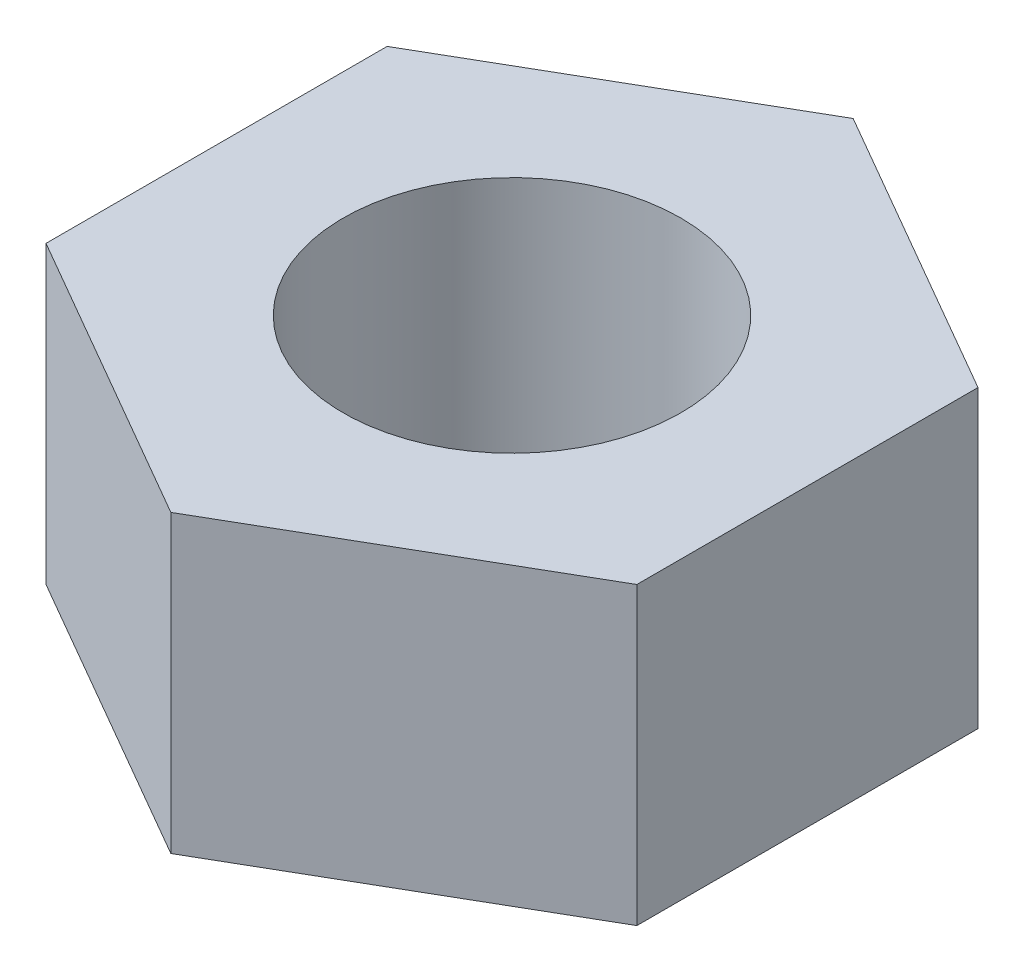
ISO-10303-21;
HEADER;
FILE_DESCRIPTION(('STEP AP214'),'2;1');
FILE_NAME('part.step','',(''),(''),'','','');
FILE_SCHEMA(('AUTOMOTIVE_DESIGN { 1 0 10303 214 1 1 1 1 }'));
ENDSEC;
DATA;
#1=APPLICATION_CONTEXT('core data for automotive mechanical design processes');
#2=APPLICATION_PROTOCOL_DEFINITION('international standard','automotive_design',2000,#1);
#3=PRODUCT_CONTEXT('',#1,'mechanical');
#4=PRODUCT('Part','Part','',(#3));
#5=PRODUCT_RELATED_PRODUCT_CATEGORY('part','',(#4));
#6=PRODUCT_DEFINITION_FORMATION('','',#4);
#7=PRODUCT_DEFINITION_CONTEXT('part definition',#1,'design');
#8=PRODUCT_DEFINITION('design','',#6,#7);
#9=PRODUCT_DEFINITION_SHAPE('','',#8);
#10=(LENGTH_UNIT() NAMED_UNIT(*) SI_UNIT(.MILLI.,.METRE.));
#11=(NAMED_UNIT(*) PLANE_ANGLE_UNIT() SI_UNIT($,.RADIAN.));
#12=(NAMED_UNIT(*) SI_UNIT($,.STERADIAN.) SOLID_ANGLE_UNIT());
#13=UNCERTAINTY_MEASURE_WITH_UNIT(LENGTH_MEASURE(1.E-05),#10,'distance_accuracy_value','');
#14=(GEOMETRIC_REPRESENTATION_CONTEXT(3) GLOBAL_UNCERTAINTY_ASSIGNED_CONTEXT((#13)) GLOBAL_UNIT_ASSIGNED_CONTEXT((#10,
#11,#12)) REPRESENTATION_CONTEXT('',''));
#15=CARTESIAN_POINT('',(0.,0.,0.));
#16=DIRECTION('',(0.,0.,1.));
#17=DIRECTION('',(1.,0.,0.));
#18=AXIS2_PLACEMENT_3D('',#15,#16,#17);
#19=CARTESIAN_POINT('',(0.,2.778125,0.));
#20=DIRECTION('',(0.,1.,0.));
#21=DIRECTION('',(0.,0.,1.));
#22=AXIS2_PLACEMENT_3D('',#19,#20,#21);
#23=PLANE('',#22);
#24=DIRECTION('',(-0.866025403784439,0.,-0.5));
#25=VECTOR('',#24,1.);
#26=CARTESIAN_POINT('',(5.55625,2.778125,-3.20790243318486));
#27=LINE('',#26,#25);
#28=CARTESIAN_POINT('',(5.55625,2.778125,-3.20790243318486));
#29=VERTEX_POINT('',#28);
#30=CARTESIAN_POINT('',(0.,2.778125,-6.41580486636971));
#31=VERTEX_POINT('',#30);
#32=EDGE_CURVE('E130',#29,#31,#27,.T.);
#33=ORIENTED_EDGE('',*,*,#32,.T.);
#34=DIRECTION('',(-0.866025403784439,0.,0.5));
#35=VECTOR('',#34,1.);
#36=CARTESIAN_POINT('',(0.,2.778125,-6.41580486636971));
#37=LINE('',#36,#35);
#38=CARTESIAN_POINT('',(-5.55625,2.778125,-3.20790243318486));
#39=VERTEX_POINT('',#38);
#40=EDGE_CURVE('E97',#31,#39,#37,.T.);
#41=ORIENTED_EDGE('',*,*,#40,.T.);
#42=DIRECTION('',(0.,0.,1.));
#43=VECTOR('',#42,1.);
#44=CARTESIAN_POINT('',(-5.55625,2.778125,-3.20790243318486));
#45=LINE('',#44,#43);
#46=CARTESIAN_POINT('',(-5.55625,2.778125,3.20790243318486));
#47=VERTEX_POINT('',#46);
#48=EDGE_CURVE('E133',#39,#47,#45,.T.);
#49=ORIENTED_EDGE('',*,*,#48,.T.);
#50=DIRECTION('',(0.866025403784439,0.,0.5));
#51=VECTOR('',#50,1.);
#52=CARTESIAN_POINT('',(-5.55625,2.778125,3.20790243318486));
#53=LINE('',#52,#51);
#54=CARTESIAN_POINT('',(0.,2.778125,6.41580486636971));
#55=VERTEX_POINT('',#54);
#56=EDGE_CURVE('E135',#47,#55,#53,.T.);
#57=ORIENTED_EDGE('',*,*,#56,.T.);
#58=DIRECTION('',(0.866025403784439,0.,-0.5));
#59=VECTOR('',#58,1.);
#60=CARTESIAN_POINT('',(0.,2.778125,6.41580486636971));
#61=LINE('',#60,#59);
#62=CARTESIAN_POINT('',(5.55625,2.778125,3.20790243318486));
#63=VERTEX_POINT('',#62);
#64=EDGE_CURVE('E61',#55,#63,#61,.T.);
#65=ORIENTED_EDGE('',*,*,#64,.T.);
#66=DIRECTION('',(0.,0.,-1.));
#67=VECTOR('',#66,1.);
#68=CARTESIAN_POINT('',(5.55625,2.778125,3.20790243318486));
#69=LINE('',#68,#67);
#70=EDGE_CURVE('E56',#63,#29,#69,.T.);
#71=ORIENTED_EDGE('',*,*,#70,.T.);
#72=EDGE_LOOP('',(#33,#41,#49,#57,#65,#71));
#73=FACE_BOUND('',#72,.T.);
#74=CARTESIAN_POINT('',(0.,2.778125,0.));
#75=DIRECTION('',(0.,1.,0.));
#76=DIRECTION('',(0.,0.,1.));
#77=AXIS2_PLACEMENT_3D('',#74,#75,#76);
#78=CIRCLE('',#77,3.175);
#79=CARTESIAN_POINT('',(0.,2.778125,-3.175));
#80=VERTEX_POINT('',#79);
#81=EDGE_CURVE('E127',#80,#80,#78,.T.);
#82=ORIENTED_EDGE('',*,*,#81,.F.);
#83=EDGE_LOOP('',(#82));
#84=FACE_BOUND('',#83,.T.);
#85=ADVANCED_FACE('F41',(#73,#84),#23,.T.);
#86=CARTESIAN_POINT('',(5.55625,2.778125,-3.20790243318486));
#87=DIRECTION('',(-0.5,0.,0.866025403784439));
#88=DIRECTION('',(0.866025403784439,0.,0.5));
#89=AXIS2_PLACEMENT_3D('',#86,#87,#88);
#90=PLANE('',#89);
#91=DIRECTION('',(0.,-1.,0.));
#92=VECTOR('',#91,1.);
#93=CARTESIAN_POINT('',(5.55625,2.778125,-3.20790243318486));
#94=LINE('',#93,#92);
#95=CARTESIAN_POINT('',(5.55625,-2.778125,-3.20790243318486));
#96=VERTEX_POINT('',#95);
#97=EDGE_CURVE('E112',#29,#96,#94,.T.);
#98=ORIENTED_EDGE('',*,*,#97,.T.);
#99=DIRECTION('',(-0.866025403784439,0.,-0.5));
#100=VECTOR('',#99,1.);
#101=CARTESIAN_POINT('',(5.55625,-2.778125,-3.20790243318486));
#102=LINE('',#101,#100);
#103=CARTESIAN_POINT('',(0.,-2.778125,-6.41580486636971));
#104=VERTEX_POINT('',#103);
#105=EDGE_CURVE('E106',#96,#104,#102,.T.);
#106=ORIENTED_EDGE('',*,*,#105,.T.);
#107=DIRECTION('',(0.,-1.,0.));
#108=VECTOR('',#107,1.);
#109=CARTESIAN_POINT('',(0.,2.778125,-6.41580486636971));
#110=LINE('',#109,#108);
#111=EDGE_CURVE('E11',#31,#104,#110,.T.);
#112=ORIENTED_EDGE('',*,*,#111,.F.);
#113=ORIENTED_EDGE('',*,*,#32,.F.);
#114=EDGE_LOOP('',(#98,#106,#112,#113));
#115=FACE_BOUND('',#114,.T.);
#116=ADVANCED_FACE('F43',(#115),#90,.F.);
#117=CARTESIAN_POINT('',(0.,2.778125,-6.41580486636971));
#118=DIRECTION('',(0.499999999999999,0.,0.866025403784439));
#119=DIRECTION('',(0.866025403784439,0.,-0.5));
#120=AXIS2_PLACEMENT_3D('',#117,#118,#119);
#121=PLANE('',#120);
#122=ORIENTED_EDGE('',*,*,#111,.T.);
#123=DIRECTION('',(-0.866025403784439,0.,0.5));
#124=VECTOR('',#123,1.);
#125=CARTESIAN_POINT('',(0.,-2.778125,-6.41580486636971));
#126=LINE('',#125,#124);
#127=CARTESIAN_POINT('',(-5.55625,-2.778125,-3.20790243318486));
#128=VERTEX_POINT('',#127);
#129=EDGE_CURVE('E96',#104,#128,#126,.T.);
#130=ORIENTED_EDGE('',*,*,#129,.T.);
#131=DIRECTION('',(0.,-1.,0.));
#132=VECTOR('',#131,1.);
#133=CARTESIAN_POINT('',(-5.55625,2.778125,-3.20790243318486));
#134=LINE('',#133,#132);
#135=EDGE_CURVE('E49',#39,#128,#134,.T.);
#136=ORIENTED_EDGE('',*,*,#135,.F.);
#137=ORIENTED_EDGE('',*,*,#40,.F.);
#138=EDGE_LOOP('',(#122,#130,#136,#137));
#139=FACE_BOUND('',#138,.T.);
#140=ADVANCED_FACE('F94',(#139),#121,.F.);
#141=CARTESIAN_POINT('',(-5.55625,2.778125,-3.20790243318486));
#142=DIRECTION('',(1.,0.,0.));
#143=DIRECTION('',(0.,0.,-1.));
#144=AXIS2_PLACEMENT_3D('',#141,#142,#143);
#145=PLANE('',#144);
#146=ORIENTED_EDGE('',*,*,#135,.T.);
#147=DIRECTION('',(0.,0.,1.));
#148=VECTOR('',#147,1.);
#149=CARTESIAN_POINT('',(-5.55625,-2.778125,-3.20790243318486));
#150=LINE('',#149,#148);
#151=CARTESIAN_POINT('',(-5.55625,-2.778125,3.20790243318486));
#152=VERTEX_POINT('',#151);
#153=EDGE_CURVE('E110',#128,#152,#150,.T.);
#154=ORIENTED_EDGE('',*,*,#153,.T.);
#155=DIRECTION('',(0.,-1.,0.));
#156=VECTOR('',#155,1.);
#157=CARTESIAN_POINT('',(-5.55625,2.778125,3.20790243318486));
#158=LINE('',#157,#156);
#159=EDGE_CURVE('E144',#47,#152,#158,.T.);
#160=ORIENTED_EDGE('',*,*,#159,.F.);
#161=ORIENTED_EDGE('',*,*,#48,.F.);
#162=EDGE_LOOP('',(#146,#154,#160,#161));
#163=FACE_BOUND('',#162,.T.);
#164=ADVANCED_FACE('F147',(#163),#145,.F.);
#165=CARTESIAN_POINT('',(-5.55625,2.778125,3.20790243318486));
#166=DIRECTION('',(0.499999999999999,0.,-0.866025403784439));
#167=DIRECTION('',(-0.866025403784439,0.,-0.5));
#168=AXIS2_PLACEMENT_3D('',#165,#166,#167);
#169=PLANE('',#168);
#170=ORIENTED_EDGE('',*,*,#159,.T.);
#171=DIRECTION('',(0.866025403784439,0.,0.5));
#172=VECTOR('',#171,1.);
#173=CARTESIAN_POINT('',(-5.55625,-2.778125,3.20790243318486));
#174=LINE('',#173,#172);
#175=CARTESIAN_POINT('',(0.,-2.778125,6.41580486636971));
#176=VERTEX_POINT('',#175);
#177=EDGE_CURVE('E119',#152,#176,#174,.T.);
#178=ORIENTED_EDGE('',*,*,#177,.T.);
#179=DIRECTION('',(0.,-1.,0.));
#180=VECTOR('',#179,1.);
#181=CARTESIAN_POINT('',(0.,2.778125,6.41580486636971));
#182=LINE('',#181,#180);
#183=EDGE_CURVE('E142',#55,#176,#182,.T.);
#184=ORIENTED_EDGE('',*,*,#183,.F.);
#185=ORIENTED_EDGE('',*,*,#56,.F.);
#186=EDGE_LOOP('',(#170,#178,#184,#185));
#187=FACE_BOUND('',#186,.T.);
#188=ADVANCED_FACE('F153',(#187),#169,.F.);
#189=CARTESIAN_POINT('',(0.,2.778125,6.41580486636971));
#190=DIRECTION('',(-0.5,0.,-0.866025403784439));
#191=DIRECTION('',(-0.866025403784439,0.,0.5));
#192=AXIS2_PLACEMENT_3D('',#189,#190,#191);
#193=PLANE('',#192);
#194=ORIENTED_EDGE('',*,*,#183,.T.);
#195=DIRECTION('',(0.866025403784439,0.,-0.5));
#196=VECTOR('',#195,1.);
#197=CARTESIAN_POINT('',(0.,-2.778125,6.41580486636971));
#198=LINE('',#197,#196);
#199=CARTESIAN_POINT('',(5.55625,-2.778125,3.20790243318486));
#200=VERTEX_POINT('',#199);
#201=EDGE_CURVE('E122',#176,#200,#198,.T.);
#202=ORIENTED_EDGE('',*,*,#201,.T.);
#203=DIRECTION('',(0.,-1.,0.));
#204=VECTOR('',#203,1.);
#205=CARTESIAN_POINT('',(5.55625,2.778125,3.20790243318486));
#206=LINE('',#205,#204);
#207=EDGE_CURVE('E140',#63,#200,#206,.T.);
#208=ORIENTED_EDGE('',*,*,#207,.F.);
#209=ORIENTED_EDGE('',*,*,#64,.F.);
#210=EDGE_LOOP('',(#194,#202,#208,#209));
#211=FACE_BOUND('',#210,.T.);
#212=ADVANCED_FACE('F156',(#211),#193,.F.);
#213=CARTESIAN_POINT('',(5.55625,2.778125,3.20790243318486));
#214=DIRECTION('',(-1.,0.,0.));
#215=DIRECTION('',(0.,0.,1.));
#216=AXIS2_PLACEMENT_3D('',#213,#214,#215);
#217=PLANE('',#216);
#218=ORIENTED_EDGE('',*,*,#207,.T.);
#219=DIRECTION('',(0.,0.,-1.));
#220=VECTOR('',#219,1.);
#221=CARTESIAN_POINT('',(5.55625,-2.778125,3.20790243318486));
#222=LINE('',#221,#220);
#223=EDGE_CURVE('E125',#200,#96,#222,.T.);
#224=ORIENTED_EDGE('',*,*,#223,.T.);
#225=ORIENTED_EDGE('',*,*,#97,.F.);
#226=ORIENTED_EDGE('',*,*,#70,.F.);
#227=EDGE_LOOP('',(#218,#224,#225,#226));
#228=FACE_BOUND('',#227,.T.);
#229=ADVANCED_FACE('F158',(#228),#217,.F.);
#230=CARTESIAN_POINT('',(0.,2.778125,0.));
#231=DIRECTION('',(0.,-1.,0.));
#232=DIRECTION('',(0.,0.,-1.));
#233=AXIS2_PLACEMENT_3D('',#230,#231,#232);
#234=CYLINDRICAL_SURFACE('',#233,3.175);
#235=CARTESIAN_POINT('',(0.,-2.778125,0.));
#236=DIRECTION('',(0.,1.,0.));
#237=DIRECTION('',(0.,0.,1.));
#238=AXIS2_PLACEMENT_3D('',#235,#236,#237);
#239=CIRCLE('',#238,3.175);
#240=CARTESIAN_POINT('',(0.,-2.778125,-3.175));
#241=VERTEX_POINT('',#240);
#242=EDGE_CURVE('E113',#241,#241,#239,.T.);
#243=CARTESIAN_POINT('',(0.,2.778125,-3.175));
#244=CARTESIAN_POINT('',(0.,2.72024739583334,-3.175));
#245=CARTESIAN_POINT('',(0.,2.66236979166667,-3.175));
#246=CARTESIAN_POINT('',(0.,2.54661458333334,-3.175));
#247=CARTESIAN_POINT('',(0.,2.48873697916667,-3.175));
#248=CARTESIAN_POINT('',(0.,2.37298177083334,-3.175));
#249=CARTESIAN_POINT('',(0.,2.31510416666667,-3.175));
#250=CARTESIAN_POINT('',(0.,2.19934895833334,-3.175));
#251=CARTESIAN_POINT('',(0.,2.14147135416667,-3.175));
#252=CARTESIAN_POINT('',(0.,2.02571614583334,-3.175));
#253=CARTESIAN_POINT('',(0.,1.96783854166667,-3.175));
#254=CARTESIAN_POINT('',(0.,1.85208333333334,-3.175));
#255=CARTESIAN_POINT('',(0.,1.79420572916667,-3.175));
#256=CARTESIAN_POINT('',(0.,1.67845052083334,-3.175));
#257=CARTESIAN_POINT('',(0.,1.62057291666667,-3.175));
#258=CARTESIAN_POINT('',(0.,1.50481770833334,-3.175));
#259=CARTESIAN_POINT('',(0.,1.44694010416667,-3.175));
#260=CARTESIAN_POINT('',(0.,1.33118489583333,-3.175));
#261=CARTESIAN_POINT('',(0.,1.27330729166667,-3.175));
#262=CARTESIAN_POINT('',(0.,1.15755208333333,-3.175));
#263=CARTESIAN_POINT('',(0.,1.09967447916667,-3.175));
#264=CARTESIAN_POINT('',(0.,0.983919270833335,-3.175));
#265=CARTESIAN_POINT('',(0.,0.926041666666668,-3.175));
#266=CARTESIAN_POINT('',(0.,0.810286458333335,-3.175));
#267=CARTESIAN_POINT('',(0.,0.752408854166668,-3.175));
#268=CARTESIAN_POINT('',(0.,0.636653645833335,-3.175));
#269=CARTESIAN_POINT('',(0.,0.578776041666668,-3.175));
#270=CARTESIAN_POINT('',(0.,0.463020833333335,-3.175));
#271=CARTESIAN_POINT('',(0.,0.405143229166668,-3.175));
#272=CARTESIAN_POINT('',(0.,0.289388020833334,-3.175));
#273=CARTESIAN_POINT('',(0.,0.231510416666668,-3.175));
#274=CARTESIAN_POINT('',(0.,0.115755208333334,-3.175));
#275=CARTESIAN_POINT('',(0.,0.0578776041666675,-3.175));
#276=CARTESIAN_POINT('',(0.,-0.0578776041666658,-3.175));
#277=CARTESIAN_POINT('',(0.,-0.115755208333332,-3.175));
#278=CARTESIAN_POINT('',(0.,-0.231510416666666,-3.175));
#279=CARTESIAN_POINT('',(0.,-0.289388020833333,-3.175));
#280=CARTESIAN_POINT('',(0.,-0.405143229166666,-3.175));
#281=CARTESIAN_POINT('',(0.,-0.463020833333333,-3.175));
#282=CARTESIAN_POINT('',(0.,-0.578776041666666,-3.175));
#283=CARTESIAN_POINT('',(0.,-0.636653645833333,-3.175));
#284=CARTESIAN_POINT('',(0.,-0.752408854166666,-3.175));
#285=CARTESIAN_POINT('',(0.,-0.810286458333333,-3.175));
#286=CARTESIAN_POINT('',(0.,-0.926041666666666,-3.175));
#287=CARTESIAN_POINT('',(0.,-0.983919270833333,-3.175));
#288=CARTESIAN_POINT('',(0.,-1.09967447916667,-3.175));
#289=CARTESIAN_POINT('',(0.,-1.15755208333333,-3.175));
#290=CARTESIAN_POINT('',(0.,-1.27330729166667,-3.175));
#291=CARTESIAN_POINT('',(0.,-1.33118489583333,-3.175));
#292=CARTESIAN_POINT('',(0.,-1.44694010416667,-3.175));
#293=CARTESIAN_POINT('',(0.,-1.50481770833333,-3.175));
#294=CARTESIAN_POINT('',(0.,-1.62057291666667,-3.175));
#295=CARTESIAN_POINT('',(0.,-1.67845052083333,-3.175));
#296=CARTESIAN_POINT('',(0.,-1.79420572916667,-3.175));
#297=CARTESIAN_POINT('',(0.,-1.85208333333333,-3.175));
#298=CARTESIAN_POINT('',(0.,-1.96783854166667,-3.175));
#299=CARTESIAN_POINT('',(0.,-2.02571614583333,-3.175));
#300=CARTESIAN_POINT('',(0.,-2.14147135416667,-3.175));
#301=CARTESIAN_POINT('',(0.,-2.19934895833333,-3.175));
#302=CARTESIAN_POINT('',(0.,-2.31510416666667,-3.175));
#303=CARTESIAN_POINT('',(0.,-2.37298177083333,-3.175));
#304=CARTESIAN_POINT('',(0.,-2.48873697916667,-3.175));
#305=CARTESIAN_POINT('',(0.,-2.54661458333333,-3.175));
#306=CARTESIAN_POINT('',(0.,-2.66236979166667,-3.175));
#307=CARTESIAN_POINT('',(0.,-2.72024739583333,-3.175));
#308=CARTESIAN_POINT('',(0.,-2.778125,-3.175));
#309=B_SPLINE_CURVE_WITH_KNOTS('',3,(#243,#244,#245,#246,#247,#248,#249,#250,#251,#252,#253,
#254,#255,#256,#257,#258,#259,#260,#261,#262,#263,#264,#265,#266,#267,#268,#269,#270,#271,#272,
#273,#274,#275,#276,#277,#278,#279,#280,#281,#282,#283,#284,#285,#286,#287,#288,#289,#290,#291,
#292,#293,#294,#295,#296,#297,#298,#299,#300,#301,#302,#303,#304,#305,#306,#307,#308),
.UNSPECIFIED.,.F.,.F.,(4,2,2,2,2,2,2,2,2,2,2,2,2,2,2,2,2,2,2,2,2,2,2,2,2,2,2,2,2,2,2,2,4),(0.,
0.1736328125,0.347265625,0.5208984375,0.69453125,0.8681640625,1.041796875,1.2154296875,
1.3890625,1.5626953125,1.736328125,1.9099609375,2.08359375,2.2572265625,2.430859375,
2.6044921875,2.778125,2.9517578125,3.125390625,3.2990234375,3.47265625,3.6462890625,3.819921875,
3.9935546875,4.1671875,4.3408203125,4.514453125,4.6880859375,4.86171875,5.0353515625,
5.208984375,5.3826171875,5.55625),.UNSPECIFIED.);
#310=EDGE_CURVE('BSEAM160',#80,#241,#309,.T.);
#311=ORIENTED_EDGE('',*,*,#81,.T.);
#312=ORIENTED_EDGE('',*,*,#242,.F.);
#313=ORIENTED_EDGE('',*,*,#310,.T.);
#314=ORIENTED_EDGE('',*,*,#310,.F.);
#315=EDGE_LOOP('',(#311,#313,#312,#314));
#316=FACE_BOUND('',#315,.T.);
#317=ADVANCED_FACE('F160',(#316),#234,.F.);
#318=CARTESIAN_POINT('',(0.,-2.778125,0.));
#319=DIRECTION('',(0.,1.,0.));
#320=DIRECTION('',(0.,0.,1.));
#321=AXIS2_PLACEMENT_3D('',#318,#319,#320);
#322=PLANE('',#321);
#323=ORIENTED_EDGE('',*,*,#242,.T.);
#324=EDGE_LOOP('',(#323));
#325=FACE_BOUND('',#324,.T.);
#326=ORIENTED_EDGE('',*,*,#105,.F.);
#327=ORIENTED_EDGE('',*,*,#223,.F.);
#328=ORIENTED_EDGE('',*,*,#201,.F.);
#329=ORIENTED_EDGE('',*,*,#177,.F.);
#330=ORIENTED_EDGE('',*,*,#153,.F.);
#331=ORIENTED_EDGE('',*,*,#129,.F.);
#332=EDGE_LOOP('',(#326,#327,#328,#329,#330,#331));
#333=FACE_BOUND('',#332,.T.);
#334=ADVANCED_FACE('F104',(#325,#333),#322,.F.);
#335=CLOSED_SHELL('',(#85,#116,#140,#164,#188,#212,#229,#317,#334));
#336=MANIFOLD_SOLID_BREP('B2',#335);
#337=ADVANCED_BREP_SHAPE_REPRESENTATION('',(#18,#336),#14);
#338=SHAPE_DEFINITION_REPRESENTATION(#9,#337);
ENDSEC;
END-ISO-10303-21;
